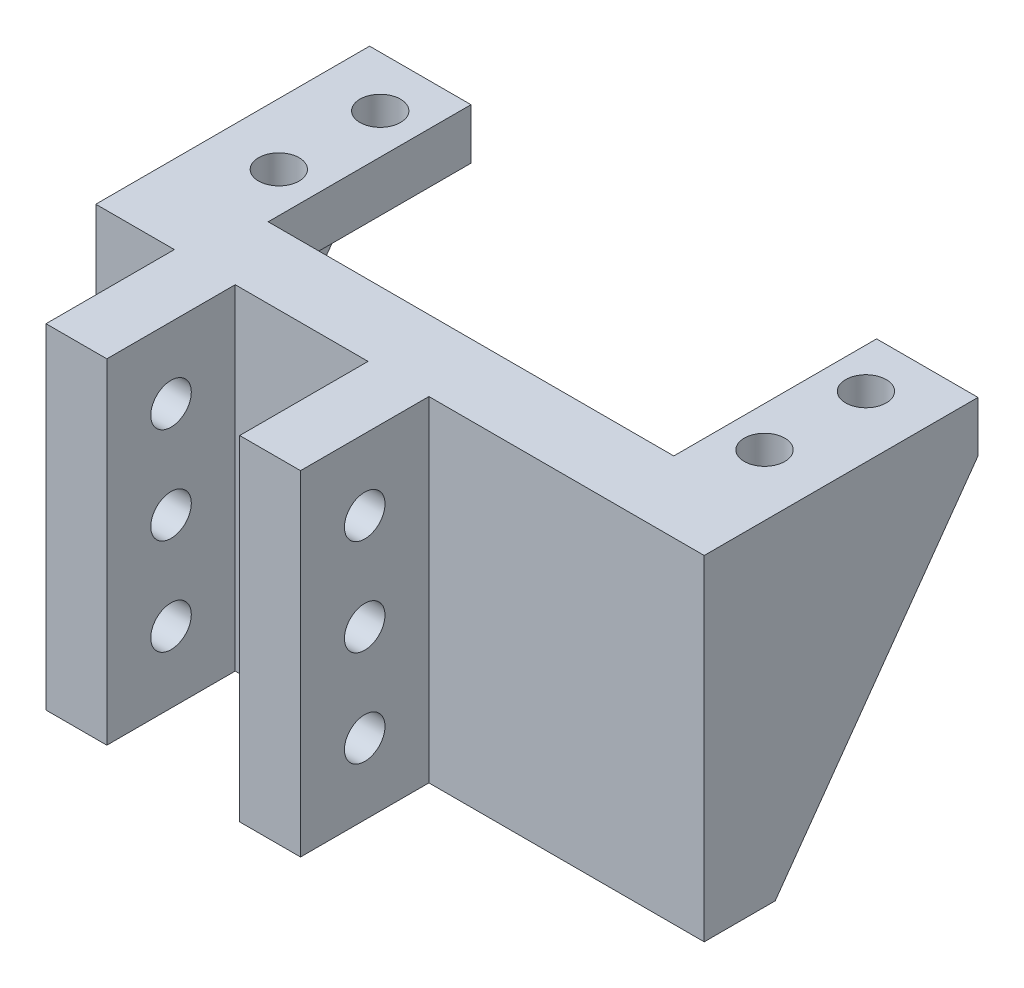
ISO-10303-21;
HEADER;
FILE_DESCRIPTION(('STEP AP214'),'2;1');
FILE_NAME('part.step','',(''),(''),'','','');
FILE_SCHEMA(('AUTOMOTIVE_DESIGN { 1 0 10303 214 1 1 1 1 }'));
ENDSEC;
DATA;
#1=APPLICATION_CONTEXT('core data for automotive mechanical design processes');
#2=APPLICATION_PROTOCOL_DEFINITION('international standard','automotive_design',2000,#1);
#3=PRODUCT_CONTEXT('',#1,'mechanical');
#4=PRODUCT('Part','Part','',(#3));
#5=PRODUCT_RELATED_PRODUCT_CATEGORY('part','',(#4));
#6=PRODUCT_DEFINITION_FORMATION('','',#4);
#7=PRODUCT_DEFINITION_CONTEXT('part definition',#1,'design');
#8=PRODUCT_DEFINITION('design','',#6,#7);
#9=PRODUCT_DEFINITION_SHAPE('','',#8);
#10=(LENGTH_UNIT() NAMED_UNIT(*) SI_UNIT(.MILLI.,.METRE.));
#11=(NAMED_UNIT(*) PLANE_ANGLE_UNIT() SI_UNIT($,.RADIAN.));
#12=(NAMED_UNIT(*) SI_UNIT($,.STERADIAN.) SOLID_ANGLE_UNIT());
#13=UNCERTAINTY_MEASURE_WITH_UNIT(LENGTH_MEASURE(1.E-05),#10,'distance_accuracy_value','');
#14=(GEOMETRIC_REPRESENTATION_CONTEXT(3) GLOBAL_UNCERTAINTY_ASSIGNED_CONTEXT((#13)) GLOBAL_UNIT_ASSIGNED_CONTEXT((#10,
#11,#12)) REPRESENTATION_CONTEXT('',''));
#15=CARTESIAN_POINT('',(0.,0.,0.));
#16=DIRECTION('',(0.,0.,1.));
#17=DIRECTION('',(1.,0.,0.));
#18=AXIS2_PLACEMENT_3D('',#15,#16,#17);
#19=CARTESIAN_POINT('',(0.,0.,0.));
#20=DIRECTION('',(0.,1.,0.));
#21=DIRECTION('',(0.,0.,1.));
#22=AXIS2_PLACEMENT_3D('',#19,#20,#21);
#23=PLANE('',#22);
#24=CARTESIAN_POINT('',(43.95,0.,-15.));
#25=DIRECTION('',(0.,-1.,0.));
#26=DIRECTION('',(0.,0.,-1.));
#27=AXIS2_PLACEMENT_3D('',#24,#25,#26);
#28=CIRCLE('',#27,2.);
#29=CARTESIAN_POINT('',(43.95,0.,-17.));
#30=VERTEX_POINT('',#29);
#31=EDGE_CURVE('E223',#30,#30,#28,.T.);
#32=ORIENTED_EDGE('',*,*,#31,.F.);
#33=EDGE_LOOP('',(#32));
#34=FACE_BOUND('',#33,.T.);
#35=CARTESIAN_POINT('',(43.95,0.,-5.00000000000001));
#36=DIRECTION('',(0.,-1.,0.));
#37=DIRECTION('',(0.,0.,-1.));
#38=AXIS2_PLACEMENT_3D('',#35,#36,#37);
#39=CIRCLE('',#38,2.);
#40=CARTESIAN_POINT('',(43.95,0.,-7.00000000000001));
#41=VERTEX_POINT('',#40);
#42=EDGE_CURVE('E230',#41,#41,#39,.T.);
#43=ORIENTED_EDGE('',*,*,#42,.F.);
#44=EDGE_LOOP('',(#43));
#45=FACE_BOUND('',#44,.T.);
#46=DIRECTION('',(-1.,0.,0.));
#47=VECTOR('',#46,1.);
#48=CARTESIAN_POINT('',(76.8617393793236,0.,0.));
#49=LINE('',#48,#47);
#50=CARTESIAN_POINT('',(48.,0.,0.));
#51=VERTEX_POINT('',#50);
#52=CARTESIAN_POINT('',(40.,0.,0.));
#53=VERTEX_POINT('',#52);
#54=EDGE_CURVE('E214',#51,#53,#49,.T.);
#55=ORIENTED_EDGE('',*,*,#54,.T.);
#56=DIRECTION('',(0.,0.,-1.));
#57=VECTOR('',#56,1.);
#58=CARTESIAN_POINT('',(40.,0.,0.));
#59=LINE('',#58,#57);
#60=CARTESIAN_POINT('',(40.,0.,-20.));
#61=VERTEX_POINT('',#60);
#62=EDGE_CURVE('E368',#53,#61,#59,.T.);
#63=ORIENTED_EDGE('',*,*,#62,.T.);
#64=DIRECTION('',(1.,0.,0.));
#65=VECTOR('',#64,1.);
#66=CARTESIAN_POINT('',(0.,0.,-20.));
#67=LINE('',#66,#65);
#68=CARTESIAN_POINT('',(48.,0.,-20.));
#69=VERTEX_POINT('',#68);
#70=EDGE_CURVE('E365',#61,#69,#67,.T.);
#71=ORIENTED_EDGE('',*,*,#70,.T.);
#72=DIRECTION('',(0.,0.,1.));
#73=VECTOR('',#72,1.);
#74=CARTESIAN_POINT('',(48.,0.,0.));
#75=LINE('',#74,#73);
#76=EDGE_CURVE('E362',#69,#51,#75,.T.);
#77=ORIENTED_EDGE('',*,*,#76,.T.);
#78=EDGE_LOOP('',(#55,#63,#71,#77));
#79=FACE_BOUND('',#78,.T.);
#80=ADVANCED_FACE('F35',(#34,#45,#79),#23,.F.);
#81=CARTESIAN_POINT('',(-3.95,0.,-15.));
#82=DIRECTION('',(0.,-1.,0.));
#83=DIRECTION('',(0.,0.,-1.));
#84=AXIS2_PLACEMENT_3D('',#81,#82,#83);
#85=CIRCLE('',#84,2.);
#86=CARTESIAN_POINT('',(-3.95,0.,-17.));
#87=VERTEX_POINT('',#86);
#88=EDGE_CURVE('E218',#87,#87,#85,.T.);
#89=ORIENTED_EDGE('',*,*,#88,.F.);
#90=EDGE_LOOP('',(#89));
#91=FACE_BOUND('',#90,.T.);
#92=CARTESIAN_POINT('',(-3.95,0.,-5.00000000000001));
#93=DIRECTION('',(0.,-1.,0.));
#94=DIRECTION('',(0.,0.,-1.));
#95=AXIS2_PLACEMENT_3D('',#92,#93,#94);
#96=CIRCLE('',#95,2.);
#97=CARTESIAN_POINT('',(-3.95,0.,-7.00000000000001));
#98=VERTEX_POINT('',#97);
#99=EDGE_CURVE('E224',#98,#98,#96,.T.);
#100=ORIENTED_EDGE('',*,*,#99,.F.);
#101=EDGE_LOOP('',(#100));
#102=FACE_BOUND('',#101,.T.);
#103=DIRECTION('',(1.,0.,0.));
#104=VECTOR('',#103,1.);
#105=CARTESIAN_POINT('',(0.,0.,0.));
#106=LINE('',#105,#104);
#107=CARTESIAN_POINT('',(-8.,0.,0.));
#108=VERTEX_POINT('',#107);
#109=CARTESIAN_POINT('',(0.,0.,0.));
#110=VERTEX_POINT('',#109);
#111=EDGE_CURVE('E296',#108,#110,#106,.T.);
#112=ORIENTED_EDGE('',*,*,#111,.F.);
#113=DIRECTION('',(0.,0.,1.));
#114=VECTOR('',#113,1.);
#115=CARTESIAN_POINT('',(-8.,0.,0.));
#116=LINE('',#115,#114);
#117=CARTESIAN_POINT('',(-8.00000000000001,0.,-20.));
#118=VERTEX_POINT('',#117);
#119=EDGE_CURVE('E360',#118,#108,#116,.T.);
#120=ORIENTED_EDGE('',*,*,#119,.F.);
#121=DIRECTION('',(-1.,0.,0.));
#122=VECTOR('',#121,1.);
#123=CARTESIAN_POINT('',(0.,0.,-20.));
#124=LINE('',#123,#122);
#125=CARTESIAN_POINT('',(0.,0.,-20.));
#126=VERTEX_POINT('',#125);
#127=EDGE_CURVE('E184',#126,#118,#124,.T.);
#128=ORIENTED_EDGE('',*,*,#127,.F.);
#129=DIRECTION('',(0.,0.,1.));
#130=VECTOR('',#129,1.);
#131=CARTESIAN_POINT('',(0.,0.,0.));
#132=LINE('',#131,#130);
#133=EDGE_CURVE('E333',#126,#110,#132,.T.);
#134=ORIENTED_EDGE('',*,*,#133,.T.);
#135=EDGE_LOOP('',(#112,#120,#128,#134));
#136=FACE_BOUND('',#135,.T.);
#137=ADVANCED_FACE('F420',(#91,#102,#136),#23,.F.);
#138=CARTESIAN_POINT('',(0.,5.,-20.));
#139=DIRECTION('',(0.,0.,1.));
#140=DIRECTION('',(1.,0.,0.));
#141=AXIS2_PLACEMENT_3D('',#138,#139,#140);
#142=PLANE('',#141);
#143=ORIENTED_EDGE('',*,*,#127,.T.);
#144=DIRECTION('',(-1.,0.,0.));
#145=VECTOR('',#144,1.);
#146=CARTESIAN_POINT('',(50.,0.,-20.));
#147=LINE('',#146,#145);
#148=CARTESIAN_POINT('',(-10.,0.,-20.));
#149=VERTEX_POINT('',#148);
#150=EDGE_CURVE('E171',#118,#149,#147,.T.);
#151=ORIENTED_EDGE('',*,*,#150,.T.);
#152=DIRECTION('',(0.,-1.,0.));
#153=VECTOR('',#152,1.);
#154=CARTESIAN_POINT('',(-10.,5.,-20.));
#155=LINE('',#154,#153);
#156=CARTESIAN_POINT('',(-10.,5.,-20.));
#157=VERTEX_POINT('',#156);
#158=EDGE_CURVE('E182',#157,#149,#155,.T.);
#159=ORIENTED_EDGE('',*,*,#158,.F.);
#160=DIRECTION('',(-1.,0.,0.));
#161=VECTOR('',#160,1.);
#162=CARTESIAN_POINT('',(0.,5.,-20.));
#163=LINE('',#162,#161);
#164=CARTESIAN_POINT('',(0.,5.,-20.));
#165=VERTEX_POINT('',#164);
#166=EDGE_CURVE('E330',#165,#157,#163,.T.);
#167=ORIENTED_EDGE('',*,*,#166,.F.);
#168=DIRECTION('',(0.,-1.,0.));
#169=VECTOR('',#168,1.);
#170=CARTESIAN_POINT('',(0.,5.,-20.));
#171=LINE('',#170,#169);
#172=EDGE_CURVE('E358',#165,#126,#171,.T.);
#173=ORIENTED_EDGE('',*,*,#172,.T.);
#174=EDGE_LOOP('',(#143,#151,#159,#167,#173));
#175=FACE_BOUND('',#174,.T.);
#176=ADVANCED_FACE('F37',(#175),#142,.F.);
#177=CARTESIAN_POINT('',(0.,5.,19.66));
#178=DIRECTION('',(0.,0.,-1.));
#179=DIRECTION('',(-1.,0.,0.));
#180=AXIS2_PLACEMENT_3D('',#177,#178,#179);
#181=PLANE('',#180);
#182=DIRECTION('',(1.,0.,0.));
#183=VECTOR('',#182,1.);
#184=CARTESIAN_POINT('',(0.,5.,19.66));
#185=LINE('',#184,#183);
#186=CARTESIAN_POINT('',(-2.25,5.,19.66));
#187=VERTEX_POINT('',#186);
#188=CARTESIAN_POINT('',(3.75,5.,19.66));
#189=VERTEX_POINT('',#188);
#190=EDGE_CURVE('E332',#187,#189,#185,.T.);
#191=ORIENTED_EDGE('',*,*,#190,.F.);
#192=DIRECTION('',(0.,-1.,0.));
#193=VECTOR('',#192,1.);
#194=CARTESIAN_POINT('',(-2.25,5.,19.66));
#195=LINE('',#194,#193);
#196=CARTESIAN_POINT('',(-2.25,-28.,19.66));
#197=VERTEX_POINT('',#196);
#198=EDGE_CURVE('E293',#187,#197,#195,.T.);
#199=ORIENTED_EDGE('',*,*,#198,.T.);
#200=DIRECTION('',(-1.,0.,0.));
#201=VECTOR('',#200,1.);
#202=CARTESIAN_POINT('',(0.,-28.,19.66));
#203=LINE('',#202,#201);
#204=CARTESIAN_POINT('',(3.75,-28.,19.66));
#205=VERTEX_POINT('',#204);
#206=EDGE_CURVE('E311',#205,#197,#203,.T.);
#207=ORIENTED_EDGE('',*,*,#206,.F.);
#208=DIRECTION('',(0.,-1.,0.));
#209=VECTOR('',#208,1.);
#210=CARTESIAN_POINT('',(3.75,5.,19.66));
#211=LINE('',#210,#209);
#212=EDGE_CURVE('E11',#189,#205,#211,.T.);
#213=ORIENTED_EDGE('',*,*,#212,.F.);
#214=EDGE_LOOP('',(#191,#199,#207,#213));
#215=FACE_BOUND('',#214,.T.);
#216=ADVANCED_FACE('F402',(#215),#181,.F.);
#217=CARTESIAN_POINT('',(3.75,5.,0.));
#218=DIRECTION('',(1.,0.,0.));
#219=DIRECTION('',(0.,0.,-1.));
#220=AXIS2_PLACEMENT_3D('',#217,#218,#219);
#221=PLANE('',#220);
#222=CARTESIAN_POINT('',(3.75,-2.,13.33));
#223=DIRECTION('',(1.,0.,0.));
#224=DIRECTION('',(0.,0.,-1.));
#225=AXIS2_PLACEMENT_3D('',#222,#223,#224);
#226=CIRCLE('',#225,2.);
#227=CARTESIAN_POINT('',(3.75,-2.,11.33));
#228=VERTEX_POINT('',#227);
#229=EDGE_CURVE('E276',#228,#228,#226,.T.);
#230=ORIENTED_EDGE('',*,*,#229,.F.);
#231=EDGE_LOOP('',(#230));
#232=FACE_BOUND('',#231,.T.);
#233=CARTESIAN_POINT('',(3.75,-21.,13.33));
#234=DIRECTION('',(1.,0.,0.));
#235=DIRECTION('',(0.,0.,-1.));
#236=AXIS2_PLACEMENT_3D('',#233,#234,#235);
#237=CIRCLE('',#236,2.);
#238=CARTESIAN_POINT('',(3.75,-21.,11.33));
#239=VERTEX_POINT('',#238);
#240=EDGE_CURVE('E267',#239,#239,#237,.T.);
#241=ORIENTED_EDGE('',*,*,#240,.F.);
#242=EDGE_LOOP('',(#241));
#243=FACE_BOUND('',#242,.T.);
#244=CARTESIAN_POINT('',(3.75,-11.5,13.33));
#245=DIRECTION('',(1.,0.,0.));
#246=DIRECTION('',(0.,0.,-1.));
#247=AXIS2_PLACEMENT_3D('',#244,#245,#246);
#248=CIRCLE('',#247,2.);
#249=CARTESIAN_POINT('',(3.75,-11.5,11.33));
#250=VERTEX_POINT('',#249);
#251=EDGE_CURVE('E258',#250,#250,#248,.T.);
#252=ORIENTED_EDGE('',*,*,#251,.F.);
#253=EDGE_LOOP('',(#252));
#254=FACE_BOUND('',#253,.T.);
#255=ORIENTED_EDGE('',*,*,#212,.T.);
#256=DIRECTION('',(0.,0.,-1.));
#257=VECTOR('',#256,1.);
#258=CARTESIAN_POINT('',(3.75000000000001,-28.,0.));
#259=LINE('',#258,#257);
#260=CARTESIAN_POINT('',(3.75,-28.,7.));
#261=VERTEX_POINT('',#260);
#262=EDGE_CURVE('E308',#205,#261,#259,.T.);
#263=ORIENTED_EDGE('',*,*,#262,.T.);
#264=DIRECTION('',(0.,-1.,0.));
#265=VECTOR('',#264,1.);
#266=CARTESIAN_POINT('',(3.75,5.,7.));
#267=LINE('',#266,#265);
#268=CARTESIAN_POINT('',(3.75,5.,7.));
#269=VERTEX_POINT('',#268);
#270=EDGE_CURVE('E43',#269,#261,#267,.T.);
#271=ORIENTED_EDGE('',*,*,#270,.F.);
#272=DIRECTION('',(0.,0.,1.));
#273=VECTOR('',#272,1.);
#274=CARTESIAN_POINT('',(3.75,5.,0.));
#275=LINE('',#274,#273);
#276=EDGE_CURVE('E335',#269,#189,#275,.T.);
#277=ORIENTED_EDGE('',*,*,#276,.T.);
#278=EDGE_LOOP('',(#255,#263,#271,#277));
#279=FACE_BOUND('',#278,.T.);
#280=ADVANCED_FACE('F397',(#232,#243,#254,#279),#221,.T.);
#281=CARTESIAN_POINT('',(0.,5.,7.));
#282=DIRECTION('',(0.,0.,-1.));
#283=DIRECTION('',(-1.,0.,0.));
#284=AXIS2_PLACEMENT_3D('',#281,#282,#283);
#285=PLANE('',#284);
#286=ORIENTED_EDGE('',*,*,#270,.T.);
#287=DIRECTION('',(-1.,0.,0.));
#288=VECTOR('',#287,1.);
#289=CARTESIAN_POINT('',(0.,-28.,7.));
#290=LINE('',#289,#288);
#291=CARTESIAN_POINT('',(16.85,-28.,7.));
#292=VERTEX_POINT('',#291);
#293=EDGE_CURVE('E322',#292,#261,#290,.T.);
#294=ORIENTED_EDGE('',*,*,#293,.F.);
#295=DIRECTION('',(0.,-1.,0.));
#296=VECTOR('',#295,1.);
#297=CARTESIAN_POINT('',(16.85,5.,7.));
#298=LINE('',#297,#296);
#299=CARTESIAN_POINT('',(16.85,5.,7.));
#300=VERTEX_POINT('',#299);
#301=EDGE_CURVE('E384',#300,#292,#298,.T.);
#302=ORIENTED_EDGE('',*,*,#301,.F.);
#303=DIRECTION('',(1.,0.,0.));
#304=VECTOR('',#303,1.);
#305=CARTESIAN_POINT('',(0.,5.,7.));
#306=LINE('',#305,#304);
#307=EDGE_CURVE('E338',#269,#300,#306,.T.);
#308=ORIENTED_EDGE('',*,*,#307,.F.);
#309=EDGE_LOOP('',(#286,#294,#302,#308));
#310=FACE_BOUND('',#309,.T.);
#311=ADVANCED_FACE('F388',(#310),#285,.F.);
#312=CARTESIAN_POINT('',(16.85,5.,0.));
#313=DIRECTION('',(1.,0.,0.));
#314=DIRECTION('',(0.,0.,-1.));
#315=AXIS2_PLACEMENT_3D('',#312,#313,#314);
#316=PLANE('',#315);
#317=CARTESIAN_POINT('',(16.85,-2.,13.33));
#318=DIRECTION('',(1.,0.,0.));
#319=DIRECTION('',(0.,0.,-1.));
#320=AXIS2_PLACEMENT_3D('',#317,#318,#319);
#321=CIRCLE('',#320,2.);
#322=CARTESIAN_POINT('',(16.85,-2.,11.33));
#323=VERTEX_POINT('',#322);
#324=EDGE_CURVE('E273',#323,#323,#321,.T.);
#325=ORIENTED_EDGE('',*,*,#324,.T.);
#326=EDGE_LOOP('',(#325));
#327=FACE_BOUND('',#326,.T.);
#328=CARTESIAN_POINT('',(16.85,-21.,13.33));
#329=DIRECTION('',(1.,0.,0.));
#330=DIRECTION('',(0.,0.,-1.));
#331=AXIS2_PLACEMENT_3D('',#328,#329,#330);
#332=CIRCLE('',#331,2.);
#333=CARTESIAN_POINT('',(16.85,-21.,11.33));
#334=VERTEX_POINT('',#333);
#335=EDGE_CURVE('E264',#334,#334,#332,.T.);
#336=ORIENTED_EDGE('',*,*,#335,.T.);
#337=EDGE_LOOP('',(#336));
#338=FACE_BOUND('',#337,.T.);
#339=CARTESIAN_POINT('',(16.85,-11.5,13.33));
#340=DIRECTION('',(1.,0.,0.));
#341=DIRECTION('',(0.,0.,-1.));
#342=AXIS2_PLACEMENT_3D('',#339,#340,#341);
#343=CIRCLE('',#342,2.);
#344=CARTESIAN_POINT('',(16.85,-11.5,11.33));
#345=VERTEX_POINT('',#344);
#346=EDGE_CURVE('E255',#345,#345,#343,.T.);
#347=ORIENTED_EDGE('',*,*,#346,.T.);
#348=EDGE_LOOP('',(#347));
#349=FACE_BOUND('',#348,.T.);
#350=ORIENTED_EDGE('',*,*,#301,.T.);
#351=DIRECTION('',(0.,0.,-1.));
#352=VECTOR('',#351,1.);
#353=CARTESIAN_POINT('',(16.85,-28.,0.));
#354=LINE('',#353,#352);
#355=CARTESIAN_POINT('',(16.85,-28.,19.66));
#356=VERTEX_POINT('',#355);
#357=EDGE_CURVE('E319',#356,#292,#354,.T.);
#358=ORIENTED_EDGE('',*,*,#357,.F.);
#359=DIRECTION('',(0.,-1.,0.));
#360=VECTOR('',#359,1.);
#361=CARTESIAN_POINT('',(16.85,5.,19.66));
#362=LINE('',#361,#360);
#363=CARTESIAN_POINT('',(16.85,5.,19.66));
#364=VERTEX_POINT('',#363);
#365=EDGE_CURVE('E381',#364,#356,#362,.T.);
#366=ORIENTED_EDGE('',*,*,#365,.F.);
#367=DIRECTION('',(0.,0.,1.));
#368=VECTOR('',#367,1.);
#369=CARTESIAN_POINT('',(16.85,5.,0.));
#370=LINE('',#369,#368);
#371=EDGE_CURVE('E340',#300,#364,#370,.T.);
#372=ORIENTED_EDGE('',*,*,#371,.F.);
#373=EDGE_LOOP('',(#350,#358,#366,#372));
#374=FACE_BOUND('',#373,.T.);
#375=ADVANCED_FACE('F464',(#327,#338,#349,#374),#316,.F.);
#376=CARTESIAN_POINT('',(0.,5.,19.66));
#377=DIRECTION('',(0.,0.,-1.));
#378=DIRECTION('',(-1.,0.,0.));
#379=AXIS2_PLACEMENT_3D('',#376,#377,#378);
#380=PLANE('',#379);
#381=DIRECTION('',(-1.,0.,0.));
#382=VECTOR('',#381,1.);
#383=CARTESIAN_POINT('',(0.,-28.,19.66));
#384=LINE('',#383,#382);
#385=CARTESIAN_POINT('',(22.85,-28.,19.66));
#386=VERTEX_POINT('',#385);
#387=EDGE_CURVE('E317',#386,#356,#384,.T.);
#388=ORIENTED_EDGE('',*,*,#387,.F.);
#389=DIRECTION('',(0.,-1.,0.));
#390=VECTOR('',#389,1.);
#391=CARTESIAN_POINT('',(22.85,5.,19.66));
#392=LINE('',#391,#390);
#393=CARTESIAN_POINT('',(22.85,5.,19.66));
#394=VERTEX_POINT('',#393);
#395=EDGE_CURVE('E301',#394,#386,#392,.T.);
#396=ORIENTED_EDGE('',*,*,#395,.F.);
#397=DIRECTION('',(1.,0.,0.));
#398=VECTOR('',#397,1.);
#399=CARTESIAN_POINT('',(0.,5.,19.66));
#400=LINE('',#399,#398);
#401=EDGE_CURVE('E343',#364,#394,#400,.T.);
#402=ORIENTED_EDGE('',*,*,#401,.F.);
#403=ORIENTED_EDGE('',*,*,#365,.T.);
#404=EDGE_LOOP('',(#388,#396,#402,#403));
#405=FACE_BOUND('',#404,.T.);
#406=ADVANCED_FACE('F459',(#405),#380,.F.);
#407=DIRECTION('',(1.,0.,0.));
#408=VECTOR('',#407,1.);
#409=CARTESIAN_POINT('',(28.6,-28.,7.));
#410=LINE('',#409,#408);
#411=CARTESIAN_POINT('',(22.85,-28.,7.));
#412=VERTEX_POINT('',#411);
#413=CARTESIAN_POINT('',(50.,-28.,7.));
#414=VERTEX_POINT('',#413);
#415=EDGE_CURVE('E302',#412,#414,#410,.T.);
#416=ORIENTED_EDGE('',*,*,#415,.T.);
#417=DIRECTION('',(0.,-1.,0.));
#418=VECTOR('',#417,1.);
#419=CARTESIAN_POINT('',(50.,-28.,7.));
#420=LINE('',#419,#418);
#421=CARTESIAN_POINT('',(50.,5.,7.));
#422=VERTEX_POINT('',#421);
#423=EDGE_CURVE('E203',#422,#414,#420,.T.);
#424=ORIENTED_EDGE('',*,*,#423,.F.);
#425=CARTESIAN_POINT('',(22.85,5.,7.));
#426=VERTEX_POINT('',#425);
#427=EDGE_CURVE('E341',#426,#422,#306,.T.);
#428=ORIENTED_EDGE('',*,*,#427,.F.);
#429=DIRECTION('',(0.,-1.,0.));
#430=VECTOR('',#429,1.);
#431=CARTESIAN_POINT('',(22.85,5.,7.));
#432=LINE('',#431,#430);
#433=EDGE_CURVE('E291',#426,#412,#432,.T.);
#434=ORIENTED_EDGE('',*,*,#433,.T.);
#435=EDGE_LOOP('',(#416,#424,#428,#434));
#436=FACE_BOUND('',#435,.T.);
#437=ADVANCED_FACE('F451',(#436),#285,.F.);
#438=CARTESIAN_POINT('',(0.,5.,-20.));
#439=DIRECTION('',(0.,0.,-1.));
#440=DIRECTION('',(-1.,0.,0.));
#441=AXIS2_PLACEMENT_3D('',#438,#439,#440);
#442=PLANE('',#441);
#443=CARTESIAN_POINT('',(50.,0.,-20.));
#444=VERTEX_POINT('',#443);
#445=EDGE_CURVE('E50',#444,#69,#147,.T.);
#446=ORIENTED_EDGE('',*,*,#445,.T.);
#447=ORIENTED_EDGE('',*,*,#70,.F.);
#448=DIRECTION('',(0.,-1.,0.));
#449=VECTOR('',#448,1.);
#450=CARTESIAN_POINT('',(40.,5.,-20.));
#451=LINE('',#450,#449);
#452=CARTESIAN_POINT('',(40.,5.,-20.));
#453=VERTEX_POINT('',#452);
#454=EDGE_CURVE('E379',#453,#61,#451,.T.);
#455=ORIENTED_EDGE('',*,*,#454,.F.);
#456=DIRECTION('',(1.,0.,0.));
#457=VECTOR('',#456,1.);
#458=CARTESIAN_POINT('',(0.,5.,-20.));
#459=LINE('',#458,#457);
#460=CARTESIAN_POINT('',(50.,5.,-20.));
#461=VERTEX_POINT('',#460);
#462=EDGE_CURVE('E346',#453,#461,#459,.T.);
#463=ORIENTED_EDGE('',*,*,#462,.T.);
#464=DIRECTION('',(0.,1.,0.));
#465=VECTOR('',#464,1.);
#466=CARTESIAN_POINT('',(50.,-28.,-20.));
#467=LINE('',#466,#465);
#468=EDGE_CURVE('E209',#444,#461,#467,.T.);
#469=ORIENTED_EDGE('',*,*,#468,.F.);
#470=EDGE_LOOP('',(#446,#447,#455,#463,#469));
#471=FACE_BOUND('',#470,.T.);
#472=ADVANCED_FACE('F448',(#471),#442,.T.);
#473=CARTESIAN_POINT('',(40.,5.,0.));
#474=DIRECTION('',(-1.,0.,0.));
#475=DIRECTION('',(0.,0.,1.));
#476=AXIS2_PLACEMENT_3D('',#473,#474,#475);
#477=PLANE('',#476);
#478=ORIENTED_EDGE('',*,*,#62,.F.);
#479=DIRECTION('',(0.,-1.,0.));
#480=VECTOR('',#479,1.);
#481=CARTESIAN_POINT('',(40.,5.,0.));
#482=LINE('',#481,#480);
#483=CARTESIAN_POINT('',(40.,5.,0.));
#484=VERTEX_POINT('',#483);
#485=EDGE_CURVE('E376',#484,#53,#482,.T.);
#486=ORIENTED_EDGE('',*,*,#485,.F.);
#487=DIRECTION('',(0.,0.,-1.));
#488=VECTOR('',#487,1.);
#489=CARTESIAN_POINT('',(40.,5.,0.));
#490=LINE('',#489,#488);
#491=EDGE_CURVE('E349',#484,#453,#490,.T.);
#492=ORIENTED_EDGE('',*,*,#491,.T.);
#493=ORIENTED_EDGE('',*,*,#454,.T.);
#494=EDGE_LOOP('',(#478,#486,#492,#493));
#495=FACE_BOUND('',#494,.T.);
#496=ADVANCED_FACE('F429',(#495),#477,.T.);
#497=CARTESIAN_POINT('',(0.,5.,0.));
#498=DIRECTION('',(0.,0.,-1.));
#499=DIRECTION('',(-1.,0.,0.));
#500=AXIS2_PLACEMENT_3D('',#497,#498,#499);
#501=PLANE('',#500);
#502=ORIENTED_EDGE('',*,*,#485,.T.);
#503=ORIENTED_EDGE('',*,*,#54,.F.);
#504=DIRECTION('',(0.,1.,0.));
#505=VECTOR('',#504,1.);
#506=CARTESIAN_POINT('',(48.,-28.,0.));
#507=LINE('',#506,#505);
#508=CARTESIAN_POINT('',(48.,-28.,0.));
#509=VERTEX_POINT('',#508);
#510=EDGE_CURVE('E215',#509,#51,#507,.T.);
#511=ORIENTED_EDGE('',*,*,#510,.F.);
#512=DIRECTION('',(1.,0.,0.));
#513=VECTOR('',#512,1.);
#514=CARTESIAN_POINT('',(0.,-28.,0.));
#515=LINE('',#514,#513);
#516=CARTESIAN_POINT('',(-8.00000000000001,-28.,0.));
#517=VERTEX_POINT('',#516);
#518=EDGE_CURVE('E314',#517,#509,#515,.T.);
#519=ORIENTED_EDGE('',*,*,#518,.F.);
#520=DIRECTION('',(0.,1.,0.));
#521=VECTOR('',#520,1.);
#522=CARTESIAN_POINT('',(-8.,-28.,0.));
#523=LINE('',#522,#521);
#524=EDGE_CURVE('E325',#517,#108,#523,.T.);
#525=ORIENTED_EDGE('',*,*,#524,.T.);
#526=ORIENTED_EDGE('',*,*,#111,.T.);
#527=DIRECTION('',(0.,-1.,0.));
#528=VECTOR('',#527,1.);
#529=CARTESIAN_POINT('',(0.,5.,0.));
#530=LINE('',#529,#528);
#531=CARTESIAN_POINT('',(0.,5.,0.));
#532=VERTEX_POINT('',#531);
#533=EDGE_CURVE('E374',#532,#110,#530,.T.);
#534=ORIENTED_EDGE('',*,*,#533,.F.);
#535=DIRECTION('',(1.,0.,0.));
#536=VECTOR('',#535,1.);
#537=CARTESIAN_POINT('',(0.,5.,0.));
#538=LINE('',#537,#536);
#539=EDGE_CURVE('E352',#532,#484,#538,.T.);
#540=ORIENTED_EDGE('',*,*,#539,.T.);
#541=EDGE_LOOP('',(#502,#503,#511,#519,#525,#526,#534,#540));
#542=FACE_BOUND('',#541,.T.);
#543=ADVANCED_FACE('F423',(#542),#501,.T.);
#544=CARTESIAN_POINT('',(0.,5.,0.));
#545=DIRECTION('',(1.,0.,0.));
#546=DIRECTION('',(0.,0.,-1.));
#547=AXIS2_PLACEMENT_3D('',#544,#545,#546);
#548=PLANE('',#547);
#549=ORIENTED_EDGE('',*,*,#133,.F.);
#550=ORIENTED_EDGE('',*,*,#172,.F.);
#551=DIRECTION('',(0.,0.,1.));
#552=VECTOR('',#551,1.);
#553=CARTESIAN_POINT('',(0.,5.,0.));
#554=LINE('',#553,#552);
#555=EDGE_CURVE('E355',#165,#532,#554,.T.);
#556=ORIENTED_EDGE('',*,*,#555,.T.);
#557=ORIENTED_EDGE('',*,*,#533,.T.);
#558=EDGE_LOOP('',(#549,#550,#556,#557));
#559=FACE_BOUND('',#558,.T.);
#560=ADVANCED_FACE('F421',(#559),#548,.T.);
#561=CARTESIAN_POINT('',(0.,5.,0.));
#562=DIRECTION('',(0.,1.,0.));
#563=DIRECTION('',(0.,0.,1.));
#564=AXIS2_PLACEMENT_3D('',#561,#562,#563);
#565=PLANE('',#564);
#566=CARTESIAN_POINT('',(-3.95,5.,-15.));
#567=DIRECTION('',(0.,-1.,0.));
#568=DIRECTION('',(0.,0.,-1.));
#569=AXIS2_PLACEMENT_3D('',#566,#567,#568);
#570=CIRCLE('',#569,2.);
#571=CARTESIAN_POINT('',(-3.95,5.,-17.));
#572=VERTEX_POINT('',#571);
#573=EDGE_CURVE('E233',#572,#572,#570,.T.);
#574=ORIENTED_EDGE('',*,*,#573,.T.);
#575=EDGE_LOOP('',(#574));
#576=FACE_BOUND('',#575,.T.);
#577=CARTESIAN_POINT('',(43.95,5.,-5.00000000000001));
#578=DIRECTION('',(0.,-1.,0.));
#579=DIRECTION('',(0.,0.,-1.));
#580=AXIS2_PLACEMENT_3D('',#577,#578,#579);
#581=CIRCLE('',#580,2.);
#582=CARTESIAN_POINT('',(43.95,5.,-7.00000000000001));
#583=VERTEX_POINT('',#582);
#584=EDGE_CURVE('E227',#583,#583,#581,.T.);
#585=ORIENTED_EDGE('',*,*,#584,.T.);
#586=EDGE_LOOP('',(#585));
#587=FACE_BOUND('',#586,.T.);
#588=CARTESIAN_POINT('',(-3.95,5.,-5.00000000000001));
#589=DIRECTION('',(0.,-1.,0.));
#590=DIRECTION('',(0.,0.,-1.));
#591=AXIS2_PLACEMENT_3D('',#588,#589,#590);
#592=CIRCLE('',#591,2.);
#593=CARTESIAN_POINT('',(-3.95,5.,-7.00000000000001));
#594=VERTEX_POINT('',#593);
#595=EDGE_CURVE('E220',#594,#594,#592,.T.);
#596=ORIENTED_EDGE('',*,*,#595,.T.);
#597=EDGE_LOOP('',(#596));
#598=FACE_BOUND('',#597,.T.);
#599=CARTESIAN_POINT('',(43.95,5.,-15.));
#600=DIRECTION('',(0.,-1.,0.));
#601=DIRECTION('',(0.,0.,-1.));
#602=AXIS2_PLACEMENT_3D('',#599,#600,#601);
#603=CIRCLE('',#602,2.);
#604=CARTESIAN_POINT('',(43.95,5.,-17.));
#605=VERTEX_POINT('',#604);
#606=EDGE_CURVE('E238',#605,#605,#603,.T.);
#607=ORIENTED_EDGE('',*,*,#606,.T.);
#608=EDGE_LOOP('',(#607));
#609=FACE_BOUND('',#608,.T.);
#610=DIRECTION('',(0.,0.,1.));
#611=VECTOR('',#610,1.);
#612=CARTESIAN_POINT('',(-2.25,5.,19.66));
#613=LINE('',#612,#611);
#614=CARTESIAN_POINT('',(-2.24999999999999,5.,7.));
#615=VERTEX_POINT('',#614);
#616=EDGE_CURVE('E283',#615,#187,#613,.T.);
#617=ORIENTED_EDGE('',*,*,#616,.T.);
#618=ORIENTED_EDGE('',*,*,#190,.T.);
#619=ORIENTED_EDGE('',*,*,#276,.F.);
#620=ORIENTED_EDGE('',*,*,#307,.T.);
#621=ORIENTED_EDGE('',*,*,#371,.T.);
#622=ORIENTED_EDGE('',*,*,#401,.T.);
#623=DIRECTION('',(0.,0.,-1.));
#624=VECTOR('',#623,1.);
#625=CARTESIAN_POINT('',(22.85,5.,19.66));
#626=LINE('',#625,#624);
#627=EDGE_CURVE('E298',#394,#426,#626,.T.);
#628=ORIENTED_EDGE('',*,*,#627,.T.);
#629=ORIENTED_EDGE('',*,*,#427,.T.);
#630=DIRECTION('',(0.,0.,1.));
#631=VECTOR('',#630,1.);
#632=CARTESIAN_POINT('',(50.,5.,7.));
#633=LINE('',#632,#631);
#634=EDGE_CURVE('E211',#461,#422,#633,.T.);
#635=ORIENTED_EDGE('',*,*,#634,.F.);
#636=ORIENTED_EDGE('',*,*,#462,.F.);
#637=ORIENTED_EDGE('',*,*,#491,.F.);
#638=ORIENTED_EDGE('',*,*,#539,.F.);
#639=ORIENTED_EDGE('',*,*,#555,.F.);
#640=ORIENTED_EDGE('',*,*,#166,.T.);
#641=DIRECTION('',(0.,0.,-1.));
#642=VECTOR('',#641,1.);
#643=CARTESIAN_POINT('',(-10.,5.,-20.));
#644=LINE('',#643,#642);
#645=CARTESIAN_POINT('',(-10.,5.,7.));
#646=VERTEX_POINT('',#645);
#647=EDGE_CURVE('E191',#646,#157,#644,.T.);
#648=ORIENTED_EDGE('',*,*,#647,.F.);
#649=DIRECTION('',(1.,0.,0.));
#650=VECTOR('',#649,1.);
#651=CARTESIAN_POINT('',(-8.,5.,7.));
#652=LINE('',#651,#650);
#653=EDGE_CURVE('E280',#646,#615,#652,.T.);
#654=ORIENTED_EDGE('',*,*,#653,.T.);
#655=EDGE_LOOP('',(#617,#618,#619,#620,#621,#622,#628,#629,#635,#636,#637,#638,#639,#640,#648,#654));
#656=FACE_BOUND('',#655,.T.);
#657=ADVANCED_FACE('F412',(#576,#587,#598,#609,#656),#565,.T.);
#658=CARTESIAN_POINT('',(0.,-28.,0.));
#659=DIRECTION('',(0.,-1.,0.));
#660=DIRECTION('',(0.,0.,-1.));
#661=AXIS2_PLACEMENT_3D('',#658,#659,#660);
#662=PLANE('',#661);
#663=DIRECTION('',(-1.,0.,0.));
#664=VECTOR('',#663,1.);
#665=CARTESIAN_POINT('',(50.,-28.,0.));
#666=LINE('',#665,#664);
#667=CARTESIAN_POINT('',(50.,-28.,0.));
#668=VERTEX_POINT('',#667);
#669=EDGE_CURVE('E185',#668,#509,#666,.T.);
#670=ORIENTED_EDGE('',*,*,#669,.F.);
#671=DIRECTION('',(0.,0.,-1.));
#672=VECTOR('',#671,1.);
#673=CARTESIAN_POINT('',(50.,-28.,7.));
#674=LINE('',#673,#672);
#675=EDGE_CURVE('E206',#414,#668,#674,.T.);
#676=ORIENTED_EDGE('',*,*,#675,.F.);
#677=ORIENTED_EDGE('',*,*,#415,.F.);
#678=DIRECTION('',(0.,0.,-1.));
#679=VECTOR('',#678,1.);
#680=CARTESIAN_POINT('',(22.85,-28.,19.66));
#681=LINE('',#680,#679);
#682=EDGE_CURVE('E279',#386,#412,#681,.T.);
#683=ORIENTED_EDGE('',*,*,#682,.F.);
#684=ORIENTED_EDGE('',*,*,#387,.T.);
#685=ORIENTED_EDGE('',*,*,#357,.T.);
#686=ORIENTED_EDGE('',*,*,#293,.T.);
#687=ORIENTED_EDGE('',*,*,#262,.F.);
#688=ORIENTED_EDGE('',*,*,#206,.T.);
#689=DIRECTION('',(0.,0.,1.));
#690=VECTOR('',#689,1.);
#691=CARTESIAN_POINT('',(-2.25,-28.,19.66));
#692=LINE('',#691,#690);
#693=CARTESIAN_POINT('',(-2.24999999999999,-28.,7.));
#694=VERTEX_POINT('',#693);
#695=EDGE_CURVE('E284',#694,#197,#692,.T.);
#696=ORIENTED_EDGE('',*,*,#695,.F.);
#697=DIRECTION('',(1.,0.,0.));
#698=VECTOR('',#697,1.);
#699=CARTESIAN_POINT('',(-8.,-28.,7.));
#700=LINE('',#699,#698);
#701=CARTESIAN_POINT('',(-10.,-28.,7.));
#702=VERTEX_POINT('',#701);
#703=EDGE_CURVE('E288',#702,#694,#700,.T.);
#704=ORIENTED_EDGE('',*,*,#703,.F.);
#705=DIRECTION('',(0.,0.,1.));
#706=VECTOR('',#705,1.);
#707=CARTESIAN_POINT('',(-10.,-28.,-20.));
#708=LINE('',#707,#706);
#709=CARTESIAN_POINT('',(-10.,-28.,0.));
#710=VERTEX_POINT('',#709);
#711=EDGE_CURVE('E192',#710,#702,#708,.T.);
#712=ORIENTED_EDGE('',*,*,#711,.F.);
#713=EDGE_CURVE('E58',#517,#710,#666,.T.);
#714=ORIENTED_EDGE('',*,*,#713,.F.);
#715=ORIENTED_EDGE('',*,*,#518,.T.);
#716=EDGE_LOOP('',(#670,#676,#677,#683,#684,#685,#686,#687,#688,#696,#704,#712,#714,#715));
#717=FACE_BOUND('',#716,.T.);
#718=ADVANCED_FACE('F395',(#717),#662,.T.);
#719=CARTESIAN_POINT('',(22.85,5.,19.66));
#720=DIRECTION('',(-1.,0.,0.));
#721=DIRECTION('',(0.,0.,1.));
#722=AXIS2_PLACEMENT_3D('',#719,#720,#721);
#723=PLANE('',#722);
#724=CARTESIAN_POINT('',(22.85,-2.,13.33));
#725=DIRECTION('',(-1.,0.,0.));
#726=DIRECTION('',(0.,0.,1.));
#727=AXIS2_PLACEMENT_3D('',#724,#725,#726);
#728=CIRCLE('',#727,2.);
#729=CARTESIAN_POINT('',(22.85,-2.,15.33));
#730=VERTEX_POINT('',#729);
#731=EDGE_CURVE('E270',#730,#730,#728,.T.);
#732=ORIENTED_EDGE('',*,*,#731,.T.);
#733=EDGE_LOOP('',(#732));
#734=FACE_BOUND('',#733,.T.);
#735=CARTESIAN_POINT('',(22.85,-21.,13.33));
#736=DIRECTION('',(-1.,0.,0.));
#737=DIRECTION('',(0.,0.,1.));
#738=AXIS2_PLACEMENT_3D('',#735,#736,#737);
#739=CIRCLE('',#738,2.);
#740=CARTESIAN_POINT('',(22.85,-21.,15.33));
#741=VERTEX_POINT('',#740);
#742=EDGE_CURVE('E261',#741,#741,#739,.T.);
#743=ORIENTED_EDGE('',*,*,#742,.T.);
#744=EDGE_LOOP('',(#743));
#745=FACE_BOUND('',#744,.T.);
#746=CARTESIAN_POINT('',(22.85,-11.5,13.33));
#747=DIRECTION('',(-1.,0.,0.));
#748=DIRECTION('',(0.,0.,1.));
#749=AXIS2_PLACEMENT_3D('',#746,#747,#748);
#750=CIRCLE('',#749,2.);
#751=CARTESIAN_POINT('',(22.85,-11.5,15.33));
#752=VERTEX_POINT('',#751);
#753=EDGE_CURVE('E247',#752,#752,#750,.T.);
#754=ORIENTED_EDGE('',*,*,#753,.T.);
#755=EDGE_LOOP('',(#754));
#756=FACE_BOUND('',#755,.T.);
#757=ORIENTED_EDGE('',*,*,#682,.T.);
#758=ORIENTED_EDGE('',*,*,#433,.F.);
#759=ORIENTED_EDGE('',*,*,#627,.F.);
#760=ORIENTED_EDGE('',*,*,#395,.T.);
#761=EDGE_LOOP('',(#757,#758,#759,#760));
#762=FACE_BOUND('',#761,.T.);
#763=ADVANCED_FACE('F465',(#734,#745,#756,#762),#723,.F.);
#764=CARTESIAN_POINT('',(-2.25,5.,19.66));
#765=DIRECTION('',(1.,0.,0.));
#766=DIRECTION('',(0.,0.,-1.));
#767=AXIS2_PLACEMENT_3D('',#764,#765,#766);
#768=PLANE('',#767);
#769=CARTESIAN_POINT('',(-2.24999999999999,-2.,13.33));
#770=DIRECTION('',(-1.,0.,0.));
#771=DIRECTION('',(0.,0.,1.));
#772=AXIS2_PLACEMENT_3D('',#769,#770,#771);
#773=CIRCLE('',#772,2.);
#774=CARTESIAN_POINT('',(-2.24999999999999,-2.,15.33));
#775=VERTEX_POINT('',#774);
#776=EDGE_CURVE('E244',#775,#775,#773,.T.);
#777=ORIENTED_EDGE('',*,*,#776,.F.);
#778=EDGE_LOOP('',(#777));
#779=FACE_BOUND('',#778,.T.);
#780=CARTESIAN_POINT('',(-2.24999999999999,-21.,13.33));
#781=DIRECTION('',(-1.,0.,0.));
#782=DIRECTION('',(0.,0.,1.));
#783=AXIS2_PLACEMENT_3D('',#780,#781,#782);
#784=CIRCLE('',#783,2.);
#785=CARTESIAN_POINT('',(-2.24999999999999,-21.,15.33));
#786=VERTEX_POINT('',#785);
#787=EDGE_CURVE('E248',#786,#786,#784,.T.);
#788=ORIENTED_EDGE('',*,*,#787,.F.);
#789=EDGE_LOOP('',(#788));
#790=FACE_BOUND('',#789,.T.);
#791=CARTESIAN_POINT('',(-2.24999999999999,-11.5,13.33));
#792=DIRECTION('',(-1.,0.,0.));
#793=DIRECTION('',(0.,0.,1.));
#794=AXIS2_PLACEMENT_3D('',#791,#792,#793);
#795=CIRCLE('',#794,2.);
#796=CARTESIAN_POINT('',(-2.24999999999999,-11.5,15.33));
#797=VERTEX_POINT('',#796);
#798=EDGE_CURVE('E241',#797,#797,#795,.T.);
#799=ORIENTED_EDGE('',*,*,#798,.F.);
#800=EDGE_LOOP('',(#799));
#801=FACE_BOUND('',#800,.T.);
#802=ORIENTED_EDGE('',*,*,#695,.T.);
#803=ORIENTED_EDGE('',*,*,#198,.F.);
#804=ORIENTED_EDGE('',*,*,#616,.F.);
#805=DIRECTION('',(0.,-1.,0.));
#806=VECTOR('',#805,1.);
#807=CARTESIAN_POINT('',(-2.24999999999999,5.,7.));
#808=LINE('',#807,#806);
#809=EDGE_CURVE('E287',#615,#694,#808,.T.);
#810=ORIENTED_EDGE('',*,*,#809,.T.);
#811=EDGE_LOOP('',(#802,#803,#804,#810));
#812=FACE_BOUND('',#811,.T.);
#813=ADVANCED_FACE('F407',(#779,#790,#801,#812),#768,.F.);
#814=CARTESIAN_POINT('',(-8.,5.,7.));
#815=DIRECTION('',(0.,0.,-1.));
#816=DIRECTION('',(-1.,0.,0.));
#817=AXIS2_PLACEMENT_3D('',#814,#815,#816);
#818=PLANE('',#817);
#819=ORIENTED_EDGE('',*,*,#703,.T.);
#820=ORIENTED_EDGE('',*,*,#809,.F.);
#821=ORIENTED_EDGE('',*,*,#653,.F.);
#822=DIRECTION('',(0.,1.,0.));
#823=VECTOR('',#822,1.);
#824=CARTESIAN_POINT('',(-10.,5.,7.));
#825=LINE('',#824,#823);
#826=EDGE_CURVE('E195',#702,#646,#825,.T.);
#827=ORIENTED_EDGE('',*,*,#826,.F.);
#828=EDGE_LOOP('',(#819,#820,#821,#827));
#829=FACE_BOUND('',#828,.T.);
#830=ADVANCED_FACE('F410',(#829),#818,.F.);
#831=CARTESIAN_POINT('',(48.,-11.5,13.33));
#832=DIRECTION('',(-1.,0.,0.));
#833=DIRECTION('',(0.,0.,1.));
#834=AXIS2_PLACEMENT_3D('',#831,#832,#833);
#835=CYLINDRICAL_SURFACE('',#834,2.);
#836=ORIENTED_EDGE('',*,*,#251,.T.);
#837=EDGE_LOOP('',(#836));
#838=FACE_BOUND('',#837,.T.);
#839=ORIENTED_EDGE('',*,*,#798,.T.);
#840=EDGE_LOOP('',(#839));
#841=FACE_BOUND('',#840,.T.);
#842=ADVANCED_FACE('F534',(#838,#841),#835,.F.);
#843=CARTESIAN_POINT('',(48.,-21.,13.33));
#844=DIRECTION('',(-1.,0.,0.));
#845=DIRECTION('',(0.,0.,1.));
#846=AXIS2_PLACEMENT_3D('',#843,#844,#845);
#847=CYLINDRICAL_SURFACE('',#846,2.);
#848=ORIENTED_EDGE('',*,*,#240,.T.);
#849=EDGE_LOOP('',(#848));
#850=FACE_BOUND('',#849,.T.);
#851=ORIENTED_EDGE('',*,*,#787,.T.);
#852=EDGE_LOOP('',(#851));
#853=FACE_BOUND('',#852,.T.);
#854=ADVANCED_FACE('F628',(#850,#853),#847,.F.);
#855=CARTESIAN_POINT('',(48.,-2.,13.33));
#856=DIRECTION('',(-1.,0.,0.));
#857=DIRECTION('',(0.,0.,1.));
#858=AXIS2_PLACEMENT_3D('',#855,#856,#857);
#859=CYLINDRICAL_SURFACE('',#858,2.);
#860=ORIENTED_EDGE('',*,*,#229,.T.);
#861=EDGE_LOOP('',(#860));
#862=FACE_BOUND('',#861,.T.);
#863=ORIENTED_EDGE('',*,*,#776,.T.);
#864=EDGE_LOOP('',(#863));
#865=FACE_BOUND('',#864,.T.);
#866=ADVANCED_FACE('F617',(#862,#865),#859,.F.);
#867=ORIENTED_EDGE('',*,*,#753,.F.);
#868=EDGE_LOOP('',(#867));
#869=FACE_BOUND('',#868,.T.);
#870=ORIENTED_EDGE('',*,*,#346,.F.);
#871=EDGE_LOOP('',(#870));
#872=FACE_BOUND('',#871,.T.);
#873=ADVANCED_FACE('F625',(#869,#872),#835,.F.);
#874=ORIENTED_EDGE('',*,*,#742,.F.);
#875=EDGE_LOOP('',(#874));
#876=FACE_BOUND('',#875,.T.);
#877=ORIENTED_EDGE('',*,*,#335,.F.);
#878=EDGE_LOOP('',(#877));
#879=FACE_BOUND('',#878,.T.);
#880=ADVANCED_FACE('F614',(#876,#879),#847,.F.);
#881=ORIENTED_EDGE('',*,*,#731,.F.);
#882=EDGE_LOOP('',(#881));
#883=FACE_BOUND('',#882,.T.);
#884=ORIENTED_EDGE('',*,*,#324,.F.);
#885=EDGE_LOOP('',(#884));
#886=FACE_BOUND('',#885,.T.);
#887=ADVANCED_FACE('F604',(#883,#886),#859,.F.);
#888=CARTESIAN_POINT('',(43.95,5.,-15.));
#889=DIRECTION('',(0.,-1.,0.));
#890=DIRECTION('',(0.,0.,-1.));
#891=AXIS2_PLACEMENT_3D('',#888,#889,#890);
#892=CYLINDRICAL_SURFACE('',#891,2.);
#893=ORIENTED_EDGE('',*,*,#606,.F.);
#894=EDGE_LOOP('',(#893));
#895=FACE_BOUND('',#894,.T.);
#896=ORIENTED_EDGE('',*,*,#31,.T.);
#897=EDGE_LOOP('',(#896));
#898=FACE_BOUND('',#897,.T.);
#899=ADVANCED_FACE('F594',(#895,#898),#892,.F.);
#900=CARTESIAN_POINT('',(43.95,5.,-5.00000000000001));
#901=DIRECTION('',(0.,-1.,0.));
#902=DIRECTION('',(0.,0.,-1.));
#903=AXIS2_PLACEMENT_3D('',#900,#901,#902);
#904=CYLINDRICAL_SURFACE('',#903,2.);
#905=ORIENTED_EDGE('',*,*,#584,.F.);
#906=EDGE_LOOP('',(#905));
#907=FACE_BOUND('',#906,.T.);
#908=ORIENTED_EDGE('',*,*,#42,.T.);
#909=EDGE_LOOP('',(#908));
#910=FACE_BOUND('',#909,.T.);
#911=ADVANCED_FACE('F584',(#907,#910),#904,.F.);
#912=CARTESIAN_POINT('',(-3.95,5.,-5.00000000000001));
#913=DIRECTION('',(0.,-1.,0.));
#914=DIRECTION('',(0.,0.,-1.));
#915=AXIS2_PLACEMENT_3D('',#912,#913,#914);
#916=CYLINDRICAL_SURFACE('',#915,2.);
#917=ORIENTED_EDGE('',*,*,#595,.F.);
#918=EDGE_LOOP('',(#917));
#919=FACE_BOUND('',#918,.T.);
#920=ORIENTED_EDGE('',*,*,#99,.T.);
#921=EDGE_LOOP('',(#920));
#922=FACE_BOUND('',#921,.T.);
#923=ADVANCED_FACE('F572',(#919,#922),#916,.F.);
#924=CARTESIAN_POINT('',(-3.95,5.,-15.));
#925=DIRECTION('',(0.,-1.,0.));
#926=DIRECTION('',(0.,0.,-1.));
#927=AXIS2_PLACEMENT_3D('',#924,#925,#926);
#928=CYLINDRICAL_SURFACE('',#927,2.);
#929=ORIENTED_EDGE('',*,*,#573,.F.);
#930=EDGE_LOOP('',(#929));
#931=FACE_BOUND('',#930,.T.);
#932=ORIENTED_EDGE('',*,*,#88,.T.);
#933=EDGE_LOOP('',(#932));
#934=FACE_BOUND('',#933,.T.);
#935=ADVANCED_FACE('F567',(#931,#934),#928,.F.);
#936=CARTESIAN_POINT('',(48.,0.,0.));
#937=DIRECTION('',(-1.,0.,0.));
#938=DIRECTION('',(0.,0.,1.));
#939=AXIS2_PLACEMENT_3D('',#936,#937,#938);
#940=PLANE('',#939);
#941=DIRECTION('',(0.,0.813733471206735,-0.581238193719096));
#942=VECTOR('',#941,1.);
#943=CARTESIAN_POINT('',(48.,-9.45945945945946,-13.2432432432432));
#944=LINE('',#943,#942);
#945=EDGE_CURVE('E193',#509,#69,#944,.T.);
#946=ORIENTED_EDGE('',*,*,#945,.F.);
#947=ORIENTED_EDGE('',*,*,#510,.T.);
#948=ORIENTED_EDGE('',*,*,#76,.F.);
#949=EDGE_LOOP('',(#946,#947,#948));
#950=FACE_BOUND('',#949,.T.);
#951=ADVANCED_FACE('F437',(#950),#940,.T.);
#952=CARTESIAN_POINT('',(50.,0.,0.));
#953=DIRECTION('',(-1.,0.,0.));
#954=DIRECTION('',(0.,0.,1.));
#955=AXIS2_PLACEMENT_3D('',#952,#953,#954);
#956=PLANE('',#955);
#957=ORIENTED_EDGE('',*,*,#675,.T.);
#958=DIRECTION('',(0.,0.813733471206735,-0.581238193719096));
#959=VECTOR('',#958,1.);
#960=CARTESIAN_POINT('',(50.,0.,-20.));
#961=LINE('',#960,#959);
#962=EDGE_CURVE('E176',#668,#444,#961,.T.);
#963=ORIENTED_EDGE('',*,*,#962,.T.);
#964=ORIENTED_EDGE('',*,*,#468,.T.);
#965=ORIENTED_EDGE('',*,*,#634,.T.);
#966=ORIENTED_EDGE('',*,*,#423,.T.);
#967=EDGE_LOOP('',(#957,#963,#964,#965,#966));
#968=FACE_BOUND('',#967,.T.);
#969=ADVANCED_FACE('F446',(#968),#956,.F.);
#970=CARTESIAN_POINT('',(-8.,0.,0.));
#971=DIRECTION('',(-1.,0.,0.));
#972=DIRECTION('',(0.,0.,1.));
#973=AXIS2_PLACEMENT_3D('',#970,#971,#972);
#974=PLANE('',#973);
#975=ORIENTED_EDGE('',*,*,#524,.F.);
#976=DIRECTION('',(0.,0.813733471206735,-0.581238193719096));
#977=VECTOR('',#976,1.);
#978=CARTESIAN_POINT('',(-8.00000000000001,-9.45945945945946,-13.2432432432432));
#979=LINE('',#978,#977);
#980=EDGE_CURVE('E197',#517,#118,#979,.T.);
#981=ORIENTED_EDGE('',*,*,#980,.T.);
#982=ORIENTED_EDGE('',*,*,#119,.T.);
#983=EDGE_LOOP('',(#975,#981,#982));
#984=FACE_BOUND('',#983,.T.);
#985=ADVANCED_FACE('F441',(#984),#974,.F.);
#986=CARTESIAN_POINT('',(-10.,0.,0.));
#987=DIRECTION('',(-1.,0.,0.));
#988=DIRECTION('',(0.,0.,1.));
#989=AXIS2_PLACEMENT_3D('',#986,#987,#988);
#990=PLANE('',#989);
#991=DIRECTION('',(0.,0.813733471206735,-0.581238193719096));
#992=VECTOR('',#991,1.);
#993=CARTESIAN_POINT('',(-10.,0.,-20.));
#994=LINE('',#993,#992);
#995=EDGE_CURVE('E168',#710,#149,#994,.T.);
#996=ORIENTED_EDGE('',*,*,#995,.F.);
#997=ORIENTED_EDGE('',*,*,#711,.T.);
#998=ORIENTED_EDGE('',*,*,#826,.T.);
#999=ORIENTED_EDGE('',*,*,#647,.T.);
#1000=ORIENTED_EDGE('',*,*,#158,.T.);
#1001=EDGE_LOOP('',(#996,#997,#998,#999,#1000));
#1002=FACE_BOUND('',#1001,.T.);
#1003=ADVANCED_FACE('F188',(#1002),#990,.T.);
#1004=CARTESIAN_POINT('',(50.,0.,-20.));
#1005=DIRECTION('',(0.,0.581238193719096,0.813733471206735));
#1006=DIRECTION('',(0.,-0.813733471206735,0.581238193719096));
#1007=AXIS2_PLACEMENT_3D('',#1004,#1005,#1006);
#1008=PLANE('',#1007);
#1009=ORIENTED_EDGE('',*,*,#713,.T.);
#1010=ORIENTED_EDGE('',*,*,#995,.T.);
#1011=ORIENTED_EDGE('',*,*,#150,.F.);
#1012=ORIENTED_EDGE('',*,*,#980,.F.);
#1013=EDGE_LOOP('',(#1009,#1010,#1011,#1012));
#1014=FACE_BOUND('',#1013,.T.);
#1015=ADVANCED_FACE('F170',(#1014),#1008,.F.);
#1016=ORIENTED_EDGE('',*,*,#945,.T.);
#1017=ORIENTED_EDGE('',*,*,#445,.F.);
#1018=ORIENTED_EDGE('',*,*,#962,.F.);
#1019=ORIENTED_EDGE('',*,*,#669,.T.);
#1020=EDGE_LOOP('',(#1016,#1017,#1018,#1019));
#1021=FACE_BOUND('',#1020,.T.);
#1022=ADVANCED_FACE('F826',(#1021),#1008,.F.);
#1023=CLOSED_SHELL('',(#80,#137,#176,#216,#280,#311,#375,#406,#437,#472,#496,#543,#560,#657,
#718,#763,#813,#830,#842,#854,#866,#873,#880,#887,#899,#911,#923,#935,#951,#969,#985,#1003,
#1015,#1022));
#1024=MANIFOLD_SOLID_BREP('B2',#1023);
#1025=ADVANCED_BREP_SHAPE_REPRESENTATION('',(#18,#1024),#14);
#1026=SHAPE_DEFINITION_REPRESENTATION(#9,#1025);
ENDSEC;
END-ISO-10303-21;
